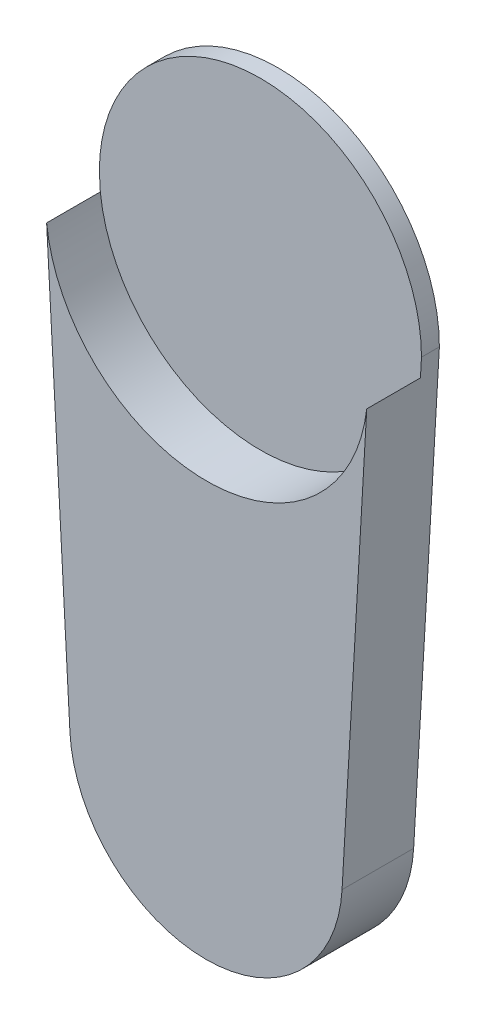
ISO-10303-21;
HEADER;
FILE_DESCRIPTION(('STEP AP214'),'2;1');
FILE_NAME('part.step','',(''),(''),'','','');
FILE_SCHEMA(('AUTOMOTIVE_DESIGN { 1 0 10303 214 1 1 1 1 }'));
ENDSEC;
DATA;
#1=APPLICATION_CONTEXT('core data for automotive mechanical design processes');
#2=APPLICATION_PROTOCOL_DEFINITION('international standard','automotive_design',2000,#1);
#3=PRODUCT_CONTEXT('',#1,'mechanical');
#4=PRODUCT('Part','Part','',(#3));
#5=PRODUCT_RELATED_PRODUCT_CATEGORY('part','',(#4));
#6=PRODUCT_DEFINITION_FORMATION('','',#4);
#7=PRODUCT_DEFINITION_CONTEXT('part definition',#1,'design');
#8=PRODUCT_DEFINITION('design','',#6,#7);
#9=PRODUCT_DEFINITION_SHAPE('','',#8);
#10=(LENGTH_UNIT() NAMED_UNIT(*) SI_UNIT(.MILLI.,.METRE.));
#11=(NAMED_UNIT(*) PLANE_ANGLE_UNIT() SI_UNIT($,.RADIAN.));
#12=(NAMED_UNIT(*) SI_UNIT($,.STERADIAN.) SOLID_ANGLE_UNIT());
#13=UNCERTAINTY_MEASURE_WITH_UNIT(LENGTH_MEASURE(1.E-05),#10,'distance_accuracy_value','');
#14=(GEOMETRIC_REPRESENTATION_CONTEXT(3) GLOBAL_UNCERTAINTY_ASSIGNED_CONTEXT((#13)) GLOBAL_UNIT_ASSIGNED_CONTEXT((#10,
#11,#12)) REPRESENTATION_CONTEXT('',''));
#15=CARTESIAN_POINT('',(0.,0.,0.));
#16=DIRECTION('',(0.,0.,1.));
#17=DIRECTION('',(1.,0.,0.));
#18=AXIS2_PLACEMENT_3D('',#15,#16,#17);
#19=CARTESIAN_POINT('',(0.,0.,10.));
#20=DIRECTION('',(0.,0.,1.));
#21=DIRECTION('',(1.,0.,0.));
#22=AXIS2_PLACEMENT_3D('',#19,#20,#21);
#23=PLANE('',#22);
#24=DIRECTION('',(0.054206538294994,-0.998529744777828,0.));
#25=VECTOR('',#24,1.);
#26=CARTESIAN_POINT('',(-89.7355486085466,-4.87141567640909,10.));
#27=LINE('',#26,#25);
#28=CARTESIAN_POINT('',(-90.,0.,10.));
#29=VERTEX_POINT('',#28);
#30=CARTESIAN_POINT('',(-89.4710972170932,-9.74283135281797,10.));
#31=VERTEX_POINT('',#30);
#32=EDGE_CURVE('E88',#29,#31,#27,.T.);
#33=ORIENTED_EDGE('',*,*,#32,.T.);
#34=CARTESIAN_POINT('',(0.,0.,10.));
#35=DIRECTION('',(0.,0.,1.));
#36=DIRECTION('',(1.,0.,0.));
#37=AXIS2_PLACEMENT_3D('',#34,#35,#36);
#38=CIRCLE('',#37,90.);
#39=CARTESIAN_POINT('',(89.4065079133182,-10.3187374589034,10.));
#40=VERTEX_POINT('',#39);
#41=EDGE_CURVE('E122',#31,#40,#38,.T.);
#42=ORIENTED_EDGE('',*,*,#41,.T.);
#43=DIRECTION('',(-0.0574210611130079,-0.998350049702336,0.));
#44=VECTOR('',#43,1.);
#45=CARTESIAN_POINT('',(89.7032539566591,-5.15936872945191,10.));
#46=LINE('',#45,#44);
#47=CARTESIAN_POINT('',(90.,0.,10.));
#48=VERTEX_POINT('',#47);
#49=EDGE_CURVE('E97',#48,#40,#46,.T.);
#50=ORIENTED_EDGE('',*,*,#49,.F.);
#51=CARTESIAN_POINT('',(0.,0.,10.));
#52=DIRECTION('',(0.,0.,1.));
#53=DIRECTION('',(1.,0.,0.));
#54=AXIS2_PLACEMENT_3D('',#51,#52,#53);
#55=CIRCLE('',#54,90.);
#56=EDGE_CURVE('E57',#48,#29,#55,.T.);
#57=ORIENTED_EDGE('',*,*,#56,.T.);
#58=EDGE_LOOP('',(#33,#42,#50,#57));
#59=FACE_BOUND('',#58,.T.);
#60=ADVANCED_FACE('F33',(#59),#23,.T.);
#61=CARTESIAN_POINT('',(89.7032539566591,-5.15936872945191,10.));
#62=DIRECTION('',(0.998350049702336,-0.0574210611130079,0.));
#63=DIRECTION('',(0.0574210611130079,0.998350049702336,0.));
#64=AXIS2_PLACEMENT_3D('',#61,#62,#63);
#65=PLANE('',#64);
#66=DIRECTION('',(-0.0574210611130079,-0.998350049702336,0.));
#67=VECTOR('',#66,1.);
#68=CARTESIAN_POINT('',(89.7032539566591,-5.15936872945191,0.));
#69=LINE('',#68,#67);
#70=CARTESIAN_POINT('',(90.,0.,0.));
#71=VERTEX_POINT('',#70);
#72=CARTESIAN_POINT('',(75.6280749058056,-249.877167958795,0.));
#73=VERTEX_POINT('',#72);
#74=EDGE_CURVE('E80',#71,#73,#69,.T.);
#75=ORIENTED_EDGE('',*,*,#74,.F.);
#76=DIRECTION('',(0.,0.,-1.));
#77=VECTOR('',#76,1.);
#78=CARTESIAN_POINT('',(90.,0.,10.));
#79=LINE('',#78,#77);
#80=EDGE_CURVE('E11',#48,#71,#79,.T.);
#81=ORIENTED_EDGE('',*,*,#80,.F.);
#82=ORIENTED_EDGE('',*,*,#49,.T.);
#83=DIRECTION('',(0.,0.,-1.));
#84=VECTOR('',#83,1.);
#85=CARTESIAN_POINT('',(89.4065079133182,-10.3187374589031,40.));
#86=LINE('',#85,#84);
#87=CARTESIAN_POINT('',(89.4065079133182,-10.3187374589031,40.));
#88=VERTEX_POINT('',#87);
#89=EDGE_CURVE('E48',#88,#40,#86,.T.);
#90=ORIENTED_EDGE('',*,*,#89,.F.);
#91=DIRECTION('',(0.0574210611130079,0.998350049702336,0.));
#92=VECTOR('',#91,1.);
#93=CARTESIAN_POINT('',(89.7032539566591,-5.15936872945191,40.));
#94=LINE('',#93,#92);
#95=CARTESIAN_POINT('',(75.6280749058055,-249.877167958795,40.));
#96=VERTEX_POINT('',#95);
#97=EDGE_CURVE('E83',#96,#88,#94,.T.);
#98=ORIENTED_EDGE('',*,*,#97,.F.);
#99=DIRECTION('',(0.,0.,-1.));
#100=VECTOR('',#99,1.);
#101=CARTESIAN_POINT('',(75.6280749058056,-249.877167958795,10.));
#102=LINE('',#101,#100);
#103=EDGE_CURVE('E77',#96,#73,#102,.T.);
#104=ORIENTED_EDGE('',*,*,#103,.T.);
#105=EDGE_LOOP('',(#75,#81,#82,#90,#98,#104));
#106=FACE_BOUND('',#105,.T.);
#107=ADVANCED_FACE('F35',(#106),#65,.T.);
#108=CARTESIAN_POINT('',(0.,0.,10.));
#109=DIRECTION('',(0.,0.,-1.));
#110=DIRECTION('',(-1.,0.,0.));
#111=AXIS2_PLACEMENT_3D('',#108,#109,#110);
#112=CYLINDRICAL_SURFACE('',#111,90.);
#113=CARTESIAN_POINT('',(0.,0.,0.));
#114=DIRECTION('',(0.,0.,1.));
#115=DIRECTION('',(1.,0.,0.));
#116=AXIS2_PLACEMENT_3D('',#113,#114,#115);
#117=CIRCLE('',#116,90.);
#118=CARTESIAN_POINT('',(-90.,0.,0.));
#119=VERTEX_POINT('',#118);
#120=EDGE_CURVE('E102',#71,#119,#117,.T.);
#121=ORIENTED_EDGE('',*,*,#120,.T.);
#122=DIRECTION('',(0.,0.,-1.));
#123=VECTOR('',#122,1.);
#124=CARTESIAN_POINT('',(-90.,0.,10.));
#125=LINE('',#124,#123);
#126=EDGE_CURVE('E41',#29,#119,#125,.T.);
#127=ORIENTED_EDGE('',*,*,#126,.F.);
#128=ORIENTED_EDGE('',*,*,#56,.F.);
#129=ORIENTED_EDGE('',*,*,#80,.T.);
#130=EDGE_LOOP('',(#121,#127,#128,#129));
#131=FACE_BOUND('',#130,.T.);
#132=ADVANCED_FACE('F117',(#131),#112,.T.);
#133=CARTESIAN_POINT('',(-89.7355486085466,-4.87141567640909,10.));
#134=DIRECTION('',(0.998529744777828,0.054206538294994,0.));
#135=DIRECTION('',(-0.054206538294994,0.998529744777828,0.));
#136=AXIS2_PLACEMENT_3D('',#133,#134,#135);
#137=PLANE('',#136);
#138=DIRECTION('',(0.054206538294994,-0.998529744777828,0.));
#139=VECTOR('',#138,1.);
#140=CARTESIAN_POINT('',(-89.7355486085466,-4.87141567640909,0.));
#141=LINE('',#140,#139);
#142=CARTESIAN_POINT('',(-76.4483695934122,-249.632359431874,0.));
#143=VERTEX_POINT('',#142);
#144=EDGE_CURVE('E98',#119,#143,#141,.T.);
#145=ORIENTED_EDGE('',*,*,#144,.T.);
#146=DIRECTION('',(0.,0.,-1.));
#147=VECTOR('',#146,1.);
#148=CARTESIAN_POINT('',(-76.4483695934122,-249.632359431874,10.));
#149=LINE('',#148,#147);
#150=CARTESIAN_POINT('',(-76.4483695934122,-249.632359431874,40.));
#151=VERTEX_POINT('',#150);
#152=EDGE_CURVE('E87',#151,#143,#149,.T.);
#153=ORIENTED_EDGE('',*,*,#152,.F.);
#154=DIRECTION('',(0.054206538294994,-0.998529744777828,0.));
#155=VECTOR('',#154,1.);
#156=CARTESIAN_POINT('',(-89.7355486085466,-4.87141567640909,40.));
#157=LINE('',#156,#155);
#158=CARTESIAN_POINT('',(-89.4710972170932,-9.74283135281797,40.));
#159=VERTEX_POINT('',#158);
#160=EDGE_CURVE('E128',#159,#151,#157,.T.);
#161=ORIENTED_EDGE('',*,*,#160,.F.);
#162=DIRECTION('',(0.,0.,-1.));
#163=VECTOR('',#162,1.);
#164=CARTESIAN_POINT('',(-89.4710972170932,-9.74283135281797,40.));
#165=LINE('',#164,#163);
#166=EDGE_CURVE('E103',#159,#31,#165,.T.);
#167=ORIENTED_EDGE('',*,*,#166,.T.);
#168=ORIENTED_EDGE('',*,*,#32,.F.);
#169=ORIENTED_EDGE('',*,*,#126,.T.);
#170=EDGE_LOOP('',(#145,#153,#161,#167,#168,#169));
#171=FACE_BOUND('',#170,.T.);
#172=ADVANCED_FACE('F115',(#171),#137,.F.);
#173=CARTESIAN_POINT('',(-0.403304821722036,-245.504150194993,10.));
#174=DIRECTION('',(0.,0.,-1.));
#175=DIRECTION('',(-1.,0.,0.));
#176=AXIS2_PLACEMENT_3D('',#173,#174,#175);
#177=CYLINDRICAL_SURFACE('',#176,76.1570350501779);
#178=CARTESIAN_POINT('',(-0.403304821722036,-245.504150194993,0.));
#179=DIRECTION('',(0.,0.,1.));
#180=DIRECTION('',(1.,0.,0.));
#181=AXIS2_PLACEMENT_3D('',#178,#179,#180);
#182=CIRCLE('',#181,76.1570350501779);
#183=EDGE_CURVE('E92',#143,#73,#182,.T.);
#184=ORIENTED_EDGE('',*,*,#183,.T.);
#185=ORIENTED_EDGE('',*,*,#103,.F.);
#186=CARTESIAN_POINT('',(-0.403304821722036,-245.504150194993,40.));
#187=DIRECTION('',(0.,0.,1.));
#188=DIRECTION('',(1.,0.,0.));
#189=AXIS2_PLACEMENT_3D('',#186,#187,#188);
#190=CIRCLE('',#189,76.1570350501779);
#191=EDGE_CURVE('E126',#151,#96,#190,.T.);
#192=ORIENTED_EDGE('',*,*,#191,.F.);
#193=ORIENTED_EDGE('',*,*,#152,.T.);
#194=EDGE_LOOP('',(#184,#185,#192,#193));
#195=FACE_BOUND('',#194,.T.);
#196=ADVANCED_FACE('F93',(#195),#177,.T.);
#197=CARTESIAN_POINT('',(0.,0.,0.));
#198=DIRECTION('',(0.,0.,1.));
#199=DIRECTION('',(1.,0.,0.));
#200=AXIS2_PLACEMENT_3D('',#197,#198,#199);
#201=PLANE('',#200);
#202=ORIENTED_EDGE('',*,*,#74,.T.);
#203=ORIENTED_EDGE('',*,*,#183,.F.);
#204=ORIENTED_EDGE('',*,*,#144,.F.);
#205=ORIENTED_EDGE('',*,*,#120,.F.);
#206=EDGE_LOOP('',(#202,#203,#204,#205));
#207=FACE_BOUND('',#206,.T.);
#208=ADVANCED_FACE('F101',(#207),#201,.F.);
#209=CARTESIAN_POINT('',(0.,0.,40.));
#210=DIRECTION('',(0.,0.,-1.));
#211=DIRECTION('',(-1.,0.,0.));
#212=AXIS2_PLACEMENT_3D('',#209,#210,#211);
#213=CYLINDRICAL_SURFACE('',#212,90.);
#214=ORIENTED_EDGE('',*,*,#41,.F.);
#215=ORIENTED_EDGE('',*,*,#166,.F.);
#216=CARTESIAN_POINT('',(0.,0.,40.));
#217=DIRECTION('',(0.,0.,1.));
#218=DIRECTION('',(1.,0.,0.));
#219=AXIS2_PLACEMENT_3D('',#216,#217,#218);
#220=CIRCLE('',#219,90.);
#221=EDGE_CURVE('E124',#159,#88,#220,.T.);
#222=ORIENTED_EDGE('',*,*,#221,.T.);
#223=ORIENTED_EDGE('',*,*,#89,.T.);
#224=EDGE_LOOP('',(#214,#215,#222,#223));
#225=FACE_BOUND('',#224,.T.);
#226=ADVANCED_FACE('F133',(#225),#213,.F.);
#227=CARTESIAN_POINT('',(0.,0.,40.));
#228=DIRECTION('',(0.,0.,1.));
#229=DIRECTION('',(1.,0.,0.));
#230=AXIS2_PLACEMENT_3D('',#227,#228,#229);
#231=PLANE('',#230);
#232=ORIENTED_EDGE('',*,*,#221,.F.);
#233=ORIENTED_EDGE('',*,*,#160,.T.);
#234=ORIENTED_EDGE('',*,*,#191,.T.);
#235=ORIENTED_EDGE('',*,*,#97,.T.);
#236=EDGE_LOOP('',(#232,#233,#234,#235));
#237=FACE_BOUND('',#236,.T.);
#238=ADVANCED_FACE('F138',(#237),#231,.T.);
#239=CLOSED_SHELL('',(#60,#107,#132,#172,#196,#208,#226,#238));
#240=MANIFOLD_SOLID_BREP('B2',#239);
#241=ADVANCED_BREP_SHAPE_REPRESENTATION('',(#18,#240),#14);
#242=SHAPE_DEFINITION_REPRESENTATION(#9,#241);
ENDSEC;
END-ISO-10303-21;
